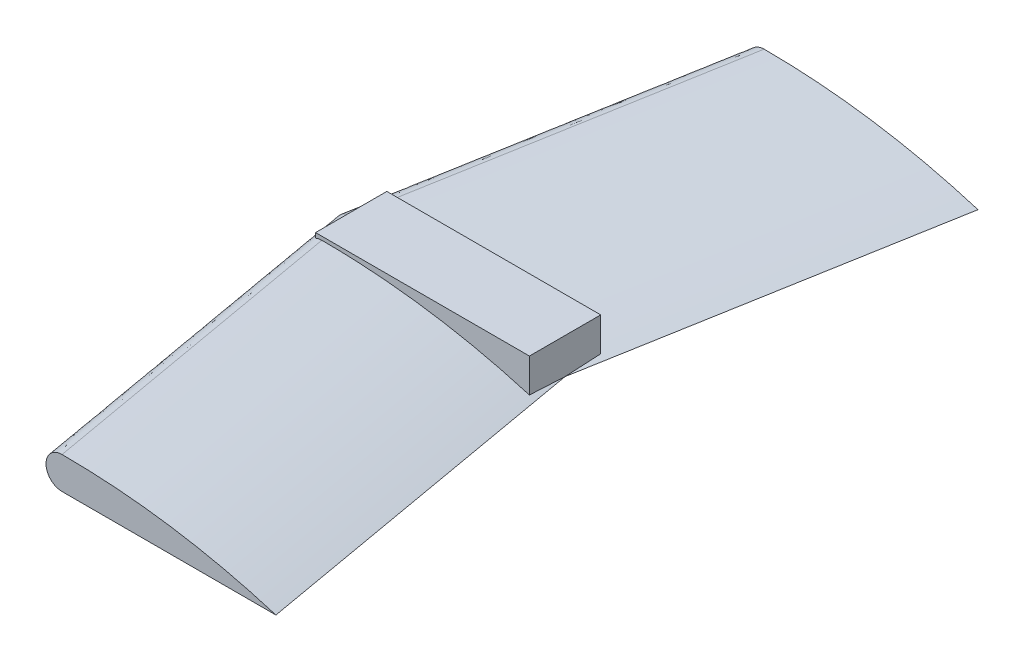
ISO-10303-21;
HEADER;
FILE_DESCRIPTION(('STEP AP214'),'2;1');
FILE_NAME('part.step','',(''),(''),'','','');
FILE_SCHEMA(('AUTOMOTIVE_DESIGN { 1 0 10303 214 1 1 1 1 }'));
ENDSEC;
DATA;
#1=APPLICATION_CONTEXT('core data for automotive mechanical design processes');
#2=APPLICATION_PROTOCOL_DEFINITION('international standard','automotive_design',2000,#1);
#3=PRODUCT_CONTEXT('',#1,'mechanical');
#4=PRODUCT('Part','Part','',(#3));
#5=PRODUCT_RELATED_PRODUCT_CATEGORY('part','',(#4));
#6=PRODUCT_DEFINITION_FORMATION('','',#4);
#7=PRODUCT_DEFINITION_CONTEXT('part definition',#1,'design');
#8=PRODUCT_DEFINITION('design','',#6,#7);
#9=PRODUCT_DEFINITION_SHAPE('','',#8);
#10=(LENGTH_UNIT() NAMED_UNIT(*) SI_UNIT(.MILLI.,.METRE.));
#11=(NAMED_UNIT(*) PLANE_ANGLE_UNIT() SI_UNIT($,.RADIAN.));
#12=(NAMED_UNIT(*) SI_UNIT($,.STERADIAN.) SOLID_ANGLE_UNIT());
#13=UNCERTAINTY_MEASURE_WITH_UNIT(LENGTH_MEASURE(1.E-05),#10,'distance_accuracy_value','');
#14=(GEOMETRIC_REPRESENTATION_CONTEXT(3) GLOBAL_UNCERTAINTY_ASSIGNED_CONTEXT((#13)) GLOBAL_UNIT_ASSIGNED_CONTEXT((#10,
#11,#12)) REPRESENTATION_CONTEXT('',''));
#15=CARTESIAN_POINT('',(0.,0.,0.));
#16=DIRECTION('',(0.,0.,1.));
#17=DIRECTION('',(1.,0.,0.));
#18=AXIS2_PLACEMENT_3D('',#15,#16,#17);
#19=CARTESIAN_POINT('',(17.3648177666927,0.,-98.4807753012208));
#20=DIRECTION('',(0.,0.,1.));
#21=DIRECTION('',(1.,0.,0.));
#22=AXIS2_PLACEMENT_3D('',#19,#20,#21);
#23=PLANE('',#22);
#24=CARTESIAN_POINT('',(17.3648177666927,0.,-98.4807753012208));
#25=DIRECTION('',(0.,0.,1.));
#26=DIRECTION('',(1.,0.,0.));
#27=AXIS2_PLACEMENT_3D('',#24,#25,#26);
#28=CIRCLE('',#27,4.5);
#29=CARTESIAN_POINT('',(17.3648177666927,4.5,-98.4807753012208));
#30=VERTEX_POINT('',#29);
#31=CARTESIAN_POINT('',(17.3648177666927,-4.5,-98.4807753012208));
#32=VERTEX_POINT('',#31);
#33=EDGE_CURVE('E317',#30,#32,#28,.T.);
#34=ORIENTED_EDGE('',*,*,#33,.F.);
#35=CARTESIAN_POINT('',(17.3648177666931,-199.999999999997,-98.4807753012208));
#36=DIRECTION('',(0.,0.,1.));
#37=DIRECTION('',(-1.,0.,0.));
#38=AXIS2_PLACEMENT_3D('',#35,#36,#37);
#39=CIRCLE('',#38,204.499999999997);
#40=CARTESIAN_POINT('',(77.3648177666927,-4.5,-98.4807753012208));
#41=VERTEX_POINT('',#40);
#42=EDGE_CURVE('E325',#41,#30,#39,.T.);
#43=ORIENTED_EDGE('',*,*,#42,.F.);
#44=DIRECTION('',(1.,0.,0.));
#45=VECTOR('',#44,1.);
#46=CARTESIAN_POINT('',(17.3648177666927,-4.5,-98.4807753012208));
#47=LINE('',#46,#45);
#48=EDGE_CURVE('E302',#32,#41,#47,.T.);
#49=ORIENTED_EDGE('',*,*,#48,.F.);
#50=EDGE_LOOP('',(#34,#43,#49));
#51=FACE_BOUND('',#50,.T.);
#52=ADVANCED_FACE('F33',(#51),#23,.F.);
#53=CARTESIAN_POINT('',(17.3648177666927,0.,98.4807753012209));
#54=DIRECTION('',(0.,0.,1.));
#55=DIRECTION('',(1.,0.,0.));
#56=AXIS2_PLACEMENT_3D('',#53,#54,#55);
#57=PLANE('',#56);
#58=CARTESIAN_POINT('',(17.3648177666927,0.,98.4807753012209));
#59=DIRECTION('',(0.,0.,1.));
#60=DIRECTION('',(1.,0.,0.));
#61=AXIS2_PLACEMENT_3D('',#58,#59,#60);
#62=CIRCLE('',#61,4.5);
#63=CARTESIAN_POINT('',(17.3648177666927,4.5,98.4807753012209));
#64=VERTEX_POINT('',#63);
#65=CARTESIAN_POINT('',(17.3648177666927,-4.5,98.4807753012209));
#66=VERTEX_POINT('',#65);
#67=EDGE_CURVE('E301',#64,#66,#62,.T.);
#68=ORIENTED_EDGE('',*,*,#67,.T.);
#69=DIRECTION('',(1.,0.,0.));
#70=VECTOR('',#69,1.);
#71=CARTESIAN_POINT('',(17.3648177666927,-4.5,98.4807753012209));
#72=LINE('',#71,#70);
#73=CARTESIAN_POINT('',(77.3648177666927,-4.5,98.4807753012209));
#74=VERTEX_POINT('',#73);
#75=EDGE_CURVE('E308',#66,#74,#72,.T.);
#76=ORIENTED_EDGE('',*,*,#75,.T.);
#77=CARTESIAN_POINT('',(17.3648177666931,-199.999999999997,98.4807753012209));
#78=DIRECTION('',(0.,0.,1.));
#79=DIRECTION('',(-1.,0.,0.));
#80=AXIS2_PLACEMENT_3D('',#77,#78,#79);
#81=CIRCLE('',#80,204.499999999997);
#82=EDGE_CURVE('E85',#74,#64,#81,.T.);
#83=ORIENTED_EDGE('',*,*,#82,.T.);
#84=EDGE_LOOP('',(#68,#76,#83));
#85=FACE_BOUND('',#84,.T.);
#86=ADVANCED_FACE('F260',(#85),#57,.T.);
#87=CARTESIAN_POINT('',(60.0000000000001,-4.50000000000003,0.));
#88=CARTESIAN_POINT('',(77.3648177666928,-4.50000000000003,-98.4807753012209));
#89=CARTESIAN_POINT('',(40.5226338305222,1.47770828730783,0.));
#90=CARTESIAN_POINT('',(57.8874515972149,1.47770828730783,-98.4807753012209));
#91=CARTESIAN_POINT('',(20.3740224125742,4.50000000000004,0.));
#92=CARTESIAN_POINT('',(37.7388401792669,4.50000000000004,-98.4807753012209));
#93=CARTESIAN_POINT('',(0.,4.5,0.));
#94=CARTESIAN_POINT('',(17.3648177666928,4.5,-98.4807753012209));
#95=(BOUNDED_SURFACE() B_SPLINE_SURFACE(3,1,((#87,#88),(#89,#90),(#91,#92),(#93,#94)),
.UNSPECIFIED.,.F.,.F.,.F.) B_SPLINE_SURFACE_WITH_KNOTS((4,4),(2,2),(0.,1.),(0.,1.),
.UNSPECIFIED.) GEOMETRIC_REPRESENTATION_ITEM() RATIONAL_B_SPLINE_SURFACE(((1.,1.),
(0.992624235245531,0.992624235245531),(0.992624235245531,0.992624235245531),(1.,1.))) REPRESENTATION_ITEM('') SURFACE());
#96=CARTESIAN_POINT('',(1.76326980708471,4.5,-10.));
#97=CARTESIAN_POINT('',(4.31250304328207,4.50002406354996,-10.));
#98=CARTESIAN_POINT('',(6.86173588443566,4.45233400801522,-10.));
#99=CARTESIAN_POINT('',(11.9564287805374,4.26170563802279,-10.));
#100=CARTESIAN_POINT('',(14.5018891275969,4.11877513094824,-10.));
#101=CARTESIAN_POINT('',(19.5856896246853,3.73784537042599,-10.));
#102=CARTESIAN_POINT('',(22.1240297592419,3.4998459105551,-10.));
#103=CARTESIAN_POINT('',(27.1902440266664,2.92909424924241,-10.));
#104=CARTESIAN_POINT('',(29.7181173317687,2.59633469364222,-10.));
#105=CARTESIAN_POINT('',(34.5836730969965,1.86305822995368,-10.));
#106=CARTESIAN_POINT('',(36.9223150867237,1.46889192678415,-10.));
#107=CARTESIAN_POINT('',(41.5846552623633,0.599429390432269,-10.));
#108=CARTESIAN_POINT('',(43.9083523367531,0.124127193576959,-10.));
#109=CARTESIAN_POINT('',(48.5391335342103,-0.907312269553418,-10.));
#110=CARTESIAN_POINT('',(50.8462073612458,-1.46349575605062,-10.));
#111=CARTESIAN_POINT('',(55.4394421310271,-2.65575788614627,-10.));
#112=CARTESIAN_POINT('',(57.7256045496751,-3.29183084382734,-10.));
#113=CARTESIAN_POINT('',(60.,-3.96751989418289,-10.));
#114=B_SPLINE_CURVE_WITH_KNOTS('',3,(#96,#97,#98,#99,#100,#101,#102,#103,#104,#105,#106,#107,
#108,#109,#110,#111,#112,#113),.UNSPECIFIED.,.F.,.F.,(4,2,2,2,2,2,2,2,4),(0.,7.64725376197817,
15.2938807136551,22.9405242685423,30.5877614273107,37.7012265312168,44.815214716319,
51.9332843364212,59.0508476339131),.UNSPECIFIED.);
#115=CARTESIAN_POINT('',(1.76326980708462,4.5,-10.));
#116=VERTEX_POINT('',#115);
#117=CARTESIAN_POINT('',(60.,-3.96751989418289,-10.));
#118=VERTEX_POINT('',#117);
#119=EDGE_CURVE('E273',#116,#118,#114,.T.);
#120=CARTESIAN_POINT('',(60.,-3.96751989418289,-10.));
#121=CARTESIAN_POINT('',(60.,-4.05482649096182,-8.33325665153762));
#122=CARTESIAN_POINT('',(60.,-4.14285313150271,-6.6665516439731));
#123=CARTESIAN_POINT('',(60.,-4.32034650010842,-3.33321831063976));
#124=CARTESIAN_POINT('',(60.,-4.40981322817324,-1.66658998487095));
#125=CARTESIAN_POINT('',(60.0000000000001,-4.50000000000003,0.));
#126=B_SPLINE_CURVE_WITH_KNOTS('',3,(#120,#121,#122,#123,#124,#125),.UNSPECIFIED.,.F.,.F.,(4,2,
4),(0.,5.00708382645729,10.0141676529146),.UNSPECIFIED.);
#127=CARTESIAN_POINT('',(60.,-4.5,0.));
#128=VERTEX_POINT('',#127);
#129=EDGE_CURVE('E238',#118,#128,#126,.T.);
#130=DIRECTION('',(0.173648177666927,0.,-0.984807753012209));
#131=VECTOR('',#130,1.);
#132=CARTESIAN_POINT('',(60.,-4.5,0.));
#133=LINE('',#132,#131);
#134=EDGE_CURVE('E322',#128,#41,#133,.T.);
#135=DIRECTION('',(0.173648177666927,0.,-0.984807753012209));
#136=VECTOR('',#135,1.);
#137=CARTESIAN_POINT('',(0.,4.5,0.));
#138=LINE('',#137,#136);
#139=EDGE_CURVE('E321',#116,#30,#138,.T.);
#140=ORIENTED_EDGE('',*,*,#119,.T.);
#141=ORIENTED_EDGE('',*,*,#129,.T.);
#142=ORIENTED_EDGE('',*,*,#134,.T.);
#143=ORIENTED_EDGE('',*,*,#42,.T.);
#144=ORIENTED_EDGE('',*,*,#139,.F.);
#145=EDGE_LOOP('',(#140,#141,#142,#143,#144));
#146=FACE_BOUND('',#145,.T.);
#147=ADVANCED_FACE('F255',(#146),#95,.F.);
#148=CARTESIAN_POINT('',(0.,4.5,0.));
#149=CARTESIAN_POINT('',(17.3648177666927,4.5,-98.4807753012209));
#150=CARTESIAN_POINT('',(-9.,4.5,0.));
#151=CARTESIAN_POINT('',(8.36481776669272,4.5,-98.4807753012209));
#152=CARTESIAN_POINT('',(-9.,-4.5,0.));
#153=CARTESIAN_POINT('',(8.36481776669273,-4.5,-98.4807753012209));
#154=CARTESIAN_POINT('',(0.,-4.5,0.));
#155=CARTESIAN_POINT('',(17.3648177666927,-4.5,-98.4807753012209));
#156=(BOUNDED_SURFACE() B_SPLINE_SURFACE(3,1,((#148,#149),(#150,#151),(#152,#153),(#154,#155)),
.UNSPECIFIED.,.F.,.F.,.F.) B_SPLINE_SURFACE_WITH_KNOTS((4,4),(2,2),(0.,1.),(0.,1.),
.UNSPECIFIED.) GEOMETRIC_REPRESENTATION_ITEM() RATIONAL_B_SPLINE_SURFACE(((1.,1.),
(0.333333333333334,0.333333333333334),(0.333333333333334,0.333333333333334),(1.,1.))) REPRESENTATION_ITEM('') SURFACE());
#157=CARTESIAN_POINT('',(0.,4.5,0.));
#158=CARTESIAN_POINT('',(0.,4.4999560199721,-0.72806018290363));
#159=CARTESIAN_POINT('',(0.,4.49450420711944,-1.4561257697866));
#160=CARTESIAN_POINT('',(0.,4.47247550616679,-2.91214142268654));
#161=CARTESIAN_POINT('',(0.,4.45589779936072,-3.64009147625868));
#162=CARTESIAN_POINT('',(0.,4.41132234884053,-5.09516813912142));
#163=CARTESIAN_POINT('',(0.,4.38333205600468,-5.82229497586553));
#164=CARTESIAN_POINT('',(0.,4.31528032364363,-7.27596308952765));
#165=CARTESIAN_POINT('',(0.,4.27521941075436,-8.00250439060597));
#166=CARTESIAN_POINT('',(0.,4.21501266792418,-8.94058180597457));
#167=CARTESIAN_POINT('',(0.,4.2008510850687,-9.15251026946948));
#168=CARTESIAN_POINT('',(0.,4.17137573738578,-9.5763070041018));
#169=CARTESIAN_POINT('',(0.,4.1560618645849,-9.7881752677265));
#170=CARTESIAN_POINT('',(0.,4.14015453665969,-10.));
#171=B_SPLINE_CURVE_WITH_KNOTS('',3,(#157,#158,#159,#160,#161,#162,#163,#164,#165,#166,#167,
#168,#169,#170),.UNSPECIFIED.,.F.,.F.,(4,2,2,2,2,2,4),(0.,2.18416920676869,4.36849915466009,
6.55140530755492,8.73421623498342,9.37141722964306,10.0086780067112),.UNSPECIFIED.);
#172=CARTESIAN_POINT('',(0.,4.5,0.));
#173=VERTEX_POINT('',#172);
#174=CARTESIAN_POINT('',(0.,4.14015453665969,-10.));
#175=VERTEX_POINT('',#174);
#176=EDGE_CURVE('E338',#173,#175,#171,.T.);
#177=CARTESIAN_POINT('',(0.,4.14015453665969,-10.));
#178=CARTESIAN_POINT('',(0.117351035793753,4.19014955914874,-10.));
#179=CARTESIAN_POINT('',(0.236837793790035,4.23512835351973,-10.));
#180=CARTESIAN_POINT('',(0.47923692282307,4.31480071270383,-10.));
#181=CARTESIAN_POINT('',(0.602150419854154,4.34949085212586,-10.));
#182=CARTESIAN_POINT('',(0.848414501444724,4.40781085334799,-10.));
#183=CARTESIAN_POINT('',(0.971723874931012,4.43161494368378,-10.));
#184=CARTESIAN_POINT('',(1.21984895903272,4.46882682676338,-10.));
#185=CARTESIAN_POINT('',(1.344663958753,4.48223934478962,-10.));
#186=CARTESIAN_POINT('',(1.56749932032844,4.49680773678931,-10.));
#187=CARTESIAN_POINT('',(1.66538958276881,4.50000724880244,-10.));
#188=CARTESIAN_POINT('',(1.76326980708462,4.5,-10.));
#189=B_SPLINE_CURVE_WITH_KNOTS('',3,(#177,#178,#179,#180,#181,#182,#183,#184,#185,#186,#187,
#188),.UNSPECIFIED.,.F.,.F.,(4,2,2,2,2,4),(0.,0.382554925948144,0.76523707290292,
1.14155946806428,1.51771064034255,1.81132479096432),.UNSPECIFIED.);
#190=EDGE_CURVE('E253',#175,#116,#189,.T.);
#191=DIRECTION('',(0.173648177666927,0.,-0.984807753012209));
#192=VECTOR('',#191,1.);
#193=CARTESIAN_POINT('',(0.,-4.5,0.));
#194=LINE('',#193,#192);
#195=CARTESIAN_POINT('',(1.76326980708462,-4.5,-10.));
#196=VERTEX_POINT('',#195);
#197=EDGE_CURVE('E77',#196,#32,#194,.T.);
#198=CARTESIAN_POINT('',(1.76326980708462,-4.5,-10.));
#199=CARTESIAN_POINT('',(1.63571288777741,-4.50001457353793,-10.));
#200=CARTESIAN_POINT('',(1.50815657816348,-4.49457718839302,-10.));
#201=CARTESIAN_POINT('',(1.25392241835073,-4.47289736924575,-10.));
#202=CARTESIAN_POINT('',(1.12724487439594,-4.45665134255892,-10.));
#203=CARTESIAN_POINT('',(0.877821485080936,-4.41381218655888,-10.));
#204=CARTESIAN_POINT('',(0.755045286008538,-4.38739550153536,-10.));
#205=CARTESIAN_POINT('',(0.512180667674857,-4.32440694095123,-10.));
#206=CARTESIAN_POINT('',(0.392091050917562,-4.28783969136826,-10.));
#207=CARTESIAN_POINT('',(0.181366420049626,-4.21392780897118,-10.));
#208=CARTESIAN_POINT('',(0.0900503273679514,-4.17851437119512,-10.));
#209=CARTESIAN_POINT('',(0.,-4.14015453665969,-10.));
#210=B_SPLINE_CURVE_WITH_KNOTS('',3,(#198,#199,#200,#201,#202,#203,#204,#205,#206,#207,#208,
#209),.UNSPECIFIED.,.F.,.F.,(4,2,2,2,2,4),(0.,0.38255492594819,0.765237072902929,
1.14155946806429,1.51771064034259,1.81132479096436),.UNSPECIFIED.);
#211=CARTESIAN_POINT('',(0.,-4.14015453665969,-10.));
#212=VERTEX_POINT('',#211);
#213=EDGE_CURVE('E280',#196,#212,#210,.T.);
#214=CARTESIAN_POINT('',(0.,-4.14015453665969,-10.));
#215=CARTESIAN_POINT('',(0.,-4.16741444516371,-9.63693798723258));
#216=CARTESIAN_POINT('',(0.,-4.1929400375232,-9.27374904409508));
#217=CARTESIAN_POINT('',(0.,-4.2406778441172,-8.5471560375621));
#218=CARTESIAN_POINT('',(0.,-4.26289008388143,-8.1837519758458));
#219=CARTESIAN_POINT('',(0.,-4.32478963967222,-7.09327740604659));
#220=CARTESIAN_POINT('',(0.,-4.35974057653092,-6.36593394451145));
#221=CARTESIAN_POINT('',(0.,-4.41784544875091,-4.91119795254887));
#222=CARTESIAN_POINT('',(0.,-4.44100605503619,-4.18380568327574));
#223=CARTESIAN_POINT('',(0.,-4.47607599679357,-2.7287579726922));
#224=CARTESIAN_POINT('',(0.,-4.4879855136196,-2.00110253581287));
#225=CARTESIAN_POINT('',(0.,-4.49626381227068,-1.06118672745433));
#226=CARTESIAN_POINT('',(0.,-4.49766513683226,-0.848962597462669));
#227=CARTESIAN_POINT('',(0.,-4.49953330303378,-0.424492560230889));
#228=CARTESIAN_POINT('',(0.,-4.50000006688821,-0.212246652648356));
#229=CARTESIAN_POINT('',(0.,-4.5,0.));
#230=B_SPLINE_CURVE_WITH_KNOTS('',3,(#214,#215,#216,#217,#218,#219,#220,#221,#222,#223,#224,
#225,#226,#227,#228,#229),.UNSPECIFIED.,.F.,.F.,(4,2,2,2,2,2,2,4),(0.,1.09224201880062,
2.18447562133392,4.36891103732877,6.55210913059169,8.73527203274488,9.37195699366786,
10.0086949450701),.UNSPECIFIED.);
#231=CARTESIAN_POINT('',(0.,-4.5,0.));
#232=VERTEX_POINT('',#231);
#233=EDGE_CURVE('E239',#212,#232,#230,.T.);
#234=CARTESIAN_POINT('',(0.,0.,0.));
#235=DIRECTION('',(0.,0.,1.));
#236=DIRECTION('',(1.,0.,0.));
#237=AXIS2_PLACEMENT_3D('',#234,#235,#236);
#238=CIRCLE('',#237,4.5);
#239=EDGE_CURVE('E41',#173,#232,#238,.T.);
#240=ORIENTED_EDGE('',*,*,#176,.T.);
#241=ORIENTED_EDGE('',*,*,#190,.T.);
#242=ORIENTED_EDGE('',*,*,#139,.T.);
#243=ORIENTED_EDGE('',*,*,#33,.T.);
#244=ORIENTED_EDGE('',*,*,#197,.F.);
#245=ORIENTED_EDGE('',*,*,#213,.T.);
#246=ORIENTED_EDGE('',*,*,#233,.T.);
#247=ORIENTED_EDGE('',*,*,#239,.F.);
#248=EDGE_LOOP('',(#240,#241,#242,#243,#244,#245,#246,#247));
#249=FACE_BOUND('',#248,.T.);
#250=ADVANCED_FACE('F223',(#249),#156,.F.);
#251=CARTESIAN_POINT('',(77.3648177666928,-4.50000000000003,98.4807753012209));
#252=CARTESIAN_POINT('',(60.0000000000001,-4.50000000000003,0.));
#253=CARTESIAN_POINT('',(57.8874515972149,1.47770828730783,98.4807753012209));
#254=CARTESIAN_POINT('',(40.5226338305222,1.47770828730783,0.));
#255=CARTESIAN_POINT('',(37.7388401792669,4.50000000000004,98.4807753012209));
#256=CARTESIAN_POINT('',(20.3740224125742,4.50000000000004,0.));
#257=CARTESIAN_POINT('',(17.3648177666928,4.5,98.4807753012209));
#258=CARTESIAN_POINT('',(0.,4.5,0.));
#259=(BOUNDED_SURFACE() B_SPLINE_SURFACE(3,1,((#251,#252),(#253,#254),(#255,#256),(#257,#258)),
.UNSPECIFIED.,.F.,.F.,.F.) B_SPLINE_SURFACE_WITH_KNOTS((4,4),(2,2),(0.,1.),(0.,1.),
.UNSPECIFIED.) GEOMETRIC_REPRESENTATION_ITEM() RATIONAL_B_SPLINE_SURFACE(((1.,1.),
(0.992624235245531,0.992624235245531),(0.992624235245531,0.992624235245531),(1.,1.))) REPRESENTATION_ITEM('') SURFACE());
#260=DIRECTION('',(-0.173648177666927,0.,-0.984807753012209));
#261=VECTOR('',#260,1.);
#262=CARTESIAN_POINT('',(77.3648177666927,-4.5,98.4807753012209));
#263=LINE('',#262,#261);
#264=EDGE_CURVE('E306',#74,#128,#263,.T.);
#265=CARTESIAN_POINT('',(60.,-4.50000000000003,-5.48172618408671E-13));
#266=CARTESIAN_POINT('',(60.,-4.40981322817326,1.6665899848705));
#267=CARTESIAN_POINT('',(60.,-4.32034650010844,3.3332183106394));
#268=CARTESIAN_POINT('',(60.,-4.14285313150273,6.66655164397292));
#269=CARTESIAN_POINT('',(60.,-4.05482649096183,8.33325665153753));
#270=CARTESIAN_POINT('',(60.,-3.9675198941829,10.));
#271=B_SPLINE_CURVE_WITH_KNOTS('',3,(#265,#266,#267,#268,#269,#270),.UNSPECIFIED.,.F.,.F.,(4,2,
4),(0.,5.00708382645756,10.0141676529151),.UNSPECIFIED.);
#272=CARTESIAN_POINT('',(60.,-3.9675198941829,10.));
#273=VERTEX_POINT('',#272);
#274=EDGE_CURVE('E231',#128,#273,#271,.T.);
#275=CARTESIAN_POINT('',(60.,-3.9675198941829,10.));
#276=CARTESIAN_POINT('',(57.5563270793277,-3.24153590683512,10.));
#277=CARTESIAN_POINT('',(55.0990666924544,-2.56129050191424,10.));
#278=CARTESIAN_POINT('',(50.1610380530868,-1.29317850456512,10.));
#279=CARTESIAN_POINT('',(47.6802717439331,-0.705304344839627,10.));
#280=CARTESIAN_POINT('',(42.6984911889531,0.377283978887767,10.));
#281=CARTESIAN_POINT('',(40.197476899174,0.871997940607508,10.));
#282=CARTESIAN_POINT('',(35.1784976419724,1.76761598314961,10.));
#283=CARTESIAN_POINT('',(32.6605313737519,2.16851277859167,10.));
#284=CARTESIAN_POINT('',(27.7876189663025,2.85119275198075,10.));
#285=CARTESIAN_POINT('',(25.4335615287736,3.13933683310108,10.));
#286=CARTESIAN_POINT('',(20.7166678228079,3.63359868892577,10.));
#287=CARTESIAN_POINT('',(18.3538309215579,3.83971043035366,10.));
#288=CARTESIAN_POINT('',(13.621062292269,4.16971492493692,10.));
#289=CARTESIAN_POINT('',(11.2511272715263,4.29356043959838,10.));
#290=CARTESIAN_POINT('',(6.50855195799038,4.45870895647658,10.));
#291=CARTESIAN_POINT('',(4.13591186961987,4.50001782948163,10.));
#292=CARTESIAN_POINT('',(1.76326980708471,4.5,10.));
#293=B_SPLINE_CURVE_WITH_KNOTS('',3,(#275,#276,#277,#278,#279,#280,#281,#282,#283,#284,#285,
#286,#287,#288,#289,#290,#291,#292),.UNSPECIFIED.,.F.,.F.,(4,2,2,2,2,2,2,2,4),(0.,
7.64725376197818,15.2938807136551,22.9405242685423,30.5877614273108,37.7012265312168,
44.815214716319,51.9332843364212,59.0508476339131),.UNSPECIFIED.);
#294=CARTESIAN_POINT('',(1.76326980708462,4.5,10.));
#295=VERTEX_POINT('',#294);
#296=EDGE_CURVE('E140',#273,#295,#293,.T.);
#297=DIRECTION('',(-0.173648177666927,0.,-0.984807753012209));
#298=VECTOR('',#297,1.);
#299=CARTESIAN_POINT('',(17.3648177666927,4.5,98.4807753012209));
#300=LINE('',#299,#298);
#301=EDGE_CURVE('E303',#64,#295,#300,.T.);
#302=ORIENTED_EDGE('',*,*,#264,.T.);
#303=ORIENTED_EDGE('',*,*,#274,.T.);
#304=ORIENTED_EDGE('',*,*,#296,.T.);
#305=ORIENTED_EDGE('',*,*,#301,.F.);
#306=ORIENTED_EDGE('',*,*,#82,.F.);
#307=EDGE_LOOP('',(#302,#303,#304,#305,#306));
#308=FACE_BOUND('',#307,.T.);
#309=ADVANCED_FACE('F218',(#308),#259,.F.);
#310=CARTESIAN_POINT('',(17.3648177666927,4.5,98.4807753012209));
#311=CARTESIAN_POINT('',(0.,4.5,0.));
#312=CARTESIAN_POINT('',(8.36481776669273,4.5,98.4807753012209));
#313=CARTESIAN_POINT('',(-9.,4.5,0.));
#314=CARTESIAN_POINT('',(8.36481776669273,-4.5,98.4807753012209));
#315=CARTESIAN_POINT('',(-9.,-4.5,0.));
#316=CARTESIAN_POINT('',(17.3648177666927,-4.5,98.4807753012209));
#317=CARTESIAN_POINT('',(0.,-4.5,0.));
#318=(BOUNDED_SURFACE() B_SPLINE_SURFACE(3,1,((#310,#311),(#312,#313),(#314,#315),(#316,#317)),
.UNSPECIFIED.,.F.,.F.,.F.) B_SPLINE_SURFACE_WITH_KNOTS((4,4),(2,2),(0.,1.),(0.,1.),
.UNSPECIFIED.) GEOMETRIC_REPRESENTATION_ITEM() RATIONAL_B_SPLINE_SURFACE(((1.,1.),
(0.333333333333334,0.333333333333334),(0.333333333333334,0.333333333333334),(1.,1.))) REPRESENTATION_ITEM('') SURFACE());
#319=CARTESIAN_POINT('',(1.76326980708462,4.5,10.));
#320=CARTESIAN_POINT('',(1.63571288777741,4.50001457353793,10.));
#321=CARTESIAN_POINT('',(1.50815657816348,4.49457718839302,10.));
#322=CARTESIAN_POINT('',(1.25392241835073,4.47289736924575,10.));
#323=CARTESIAN_POINT('',(1.12724487439594,4.45665134255892,10.));
#324=CARTESIAN_POINT('',(0.877821485080936,4.41381218655888,10.));
#325=CARTESIAN_POINT('',(0.755045286008537,4.38739550153536,10.));
#326=CARTESIAN_POINT('',(0.512180667674857,4.32440694095123,10.));
#327=CARTESIAN_POINT('',(0.392091050917562,4.28783969136826,9.99999999999999));
#328=CARTESIAN_POINT('',(0.181366420049626,4.21392780897118,9.99999999999999));
#329=CARTESIAN_POINT('',(0.0900503273679517,4.17851437119512,9.99999999999999));
#330=CARTESIAN_POINT('',(0.,4.14015453665969,10.));
#331=B_SPLINE_CURVE_WITH_KNOTS('',3,(#319,#320,#321,#322,#323,#324,#325,#326,#327,#328,#329,
#330),.UNSPECIFIED.,.F.,.F.,(4,2,2,2,2,4),(0.,0.38255492594819,0.765237072902929,
1.14155946806429,1.51771064034259,1.81132479096436),.UNSPECIFIED.);
#332=CARTESIAN_POINT('',(0.,4.14015453665969,10.));
#333=VERTEX_POINT('',#332);
#334=EDGE_CURVE('E179',#295,#333,#331,.T.);
#335=CARTESIAN_POINT('',(0.,4.14015453665969,10.));
#336=CARTESIAN_POINT('',(0.,4.16741444516371,9.63693798723257));
#337=CARTESIAN_POINT('',(0.,4.1929400375232,9.27374904409508));
#338=CARTESIAN_POINT('',(0.,4.2406778441172,8.5471560375621));
#339=CARTESIAN_POINT('',(0.,4.26289008388143,8.1837519758458));
#340=CARTESIAN_POINT('',(0.,4.32478963967222,7.09327740604659));
#341=CARTESIAN_POINT('',(0.,4.35974057653092,6.36593394451145));
#342=CARTESIAN_POINT('',(0.,4.41784544875091,4.91119795254887));
#343=CARTESIAN_POINT('',(0.,4.4410060550362,4.18380568327574));
#344=CARTESIAN_POINT('',(0.,4.47607599679357,2.7287579726922));
#345=CARTESIAN_POINT('',(0.,4.4879855136196,2.00110253581287));
#346=CARTESIAN_POINT('',(0.,4.49626381227068,1.06118672745433));
#347=CARTESIAN_POINT('',(0.,4.49766513683226,0.848962597462669));
#348=CARTESIAN_POINT('',(0.,4.49953330303379,0.424492560230889));
#349=CARTESIAN_POINT('',(0.,4.50000006688821,0.212246652648356));
#350=CARTESIAN_POINT('',(0.,4.5,0.));
#351=B_SPLINE_CURVE_WITH_KNOTS('',3,(#335,#336,#337,#338,#339,#340,#341,#342,#343,#344,#345,
#346,#347,#348,#349,#350),.UNSPECIFIED.,.F.,.F.,(4,2,2,2,2,2,2,4),(0.,1.09224201880062,
2.18447562133393,4.36891103732877,6.55210913059169,8.73527203274487,9.37195699366785,
10.0086949450701),.UNSPECIFIED.);
#352=EDGE_CURVE('E216',#333,#173,#351,.T.);
#353=CARTESIAN_POINT('',(0.,-4.5,0.));
#354=CARTESIAN_POINT('',(0.,-4.4999560199721,0.728060182903632));
#355=CARTESIAN_POINT('',(0.,-4.49450420711944,1.4561257697866));
#356=CARTESIAN_POINT('',(0.,-4.47247550616679,2.91214142268654));
#357=CARTESIAN_POINT('',(0.,-4.45589779936072,3.64009147625868));
#358=CARTESIAN_POINT('',(0.,-4.41132234884053,5.09516813912141));
#359=CARTESIAN_POINT('',(0.,-4.38333205600468,5.82229497586552));
#360=CARTESIAN_POINT('',(0.,-4.31528032364363,7.27596308952764));
#361=CARTESIAN_POINT('',(0.,-4.27521941075437,8.00250439060596));
#362=CARTESIAN_POINT('',(0.,-4.21501266792418,8.94058180597456));
#363=CARTESIAN_POINT('',(0.,-4.2008510850687,9.15251026946947));
#364=CARTESIAN_POINT('',(0.,-4.17137573738578,9.57630700410179));
#365=CARTESIAN_POINT('',(0.,-4.15606186458489,9.78817526772649));
#366=CARTESIAN_POINT('',(0.,-4.14015453665969,9.99999999999999));
#367=B_SPLINE_CURVE_WITH_KNOTS('',3,(#353,#354,#355,#356,#357,#358,#359,#360,#361,#362,#363,
#364,#365,#366),.UNSPECIFIED.,.F.,.F.,(4,2,2,2,2,2,4),(0.,2.18416920676869,4.36849915466008,
6.55140530755491,8.73421623498341,9.37141722964305,10.0086780067112),.UNSPECIFIED.);
#368=CARTESIAN_POINT('',(0.,-4.14015453665969,10.));
#369=VERTEX_POINT('',#368);
#370=EDGE_CURVE('E355',#232,#369,#367,.T.);
#371=CARTESIAN_POINT('',(0.,-4.14015453665969,9.99999999999999));
#372=CARTESIAN_POINT('',(0.117351035793753,-4.19014955914874,10.));
#373=CARTESIAN_POINT('',(0.236837793790034,-4.23512835351973,10.));
#374=CARTESIAN_POINT('',(0.479236922823069,-4.31480071270383,10.));
#375=CARTESIAN_POINT('',(0.602150419854153,-4.34949085212586,10.));
#376=CARTESIAN_POINT('',(0.848414501444723,-4.40781085334798,10.));
#377=CARTESIAN_POINT('',(0.97172387493101,-4.43161494368377,10.));
#378=CARTESIAN_POINT('',(1.21984895903272,-4.46882682676338,10.));
#379=CARTESIAN_POINT('',(1.344663958753,-4.48223934478962,10.));
#380=CARTESIAN_POINT('',(1.56749932032844,-4.49680773678931,10.));
#381=CARTESIAN_POINT('',(1.66538958276882,-4.50000724880244,10.));
#382=CARTESIAN_POINT('',(1.76326980708462,-4.5,10.));
#383=B_SPLINE_CURVE_WITH_KNOTS('',3,(#371,#372,#373,#374,#375,#376,#377,#378,#379,#380,#381,
#382),.UNSPECIFIED.,.F.,.F.,(4,2,2,2,2,4),(0.,0.382554925948143,0.765237072902919,
1.14155946806428,1.51771064034255,1.81132479096433),.UNSPECIFIED.);
#384=CARTESIAN_POINT('',(1.76326980708462,-4.5,10.));
#385=VERTEX_POINT('',#384);
#386=EDGE_CURVE('E176',#369,#385,#383,.T.);
#387=DIRECTION('',(-0.173648177666927,0.,-0.984807753012209));
#388=VECTOR('',#387,1.);
#389=CARTESIAN_POINT('',(17.3648177666927,-4.5,98.4807753012209));
#390=LINE('',#389,#388);
#391=EDGE_CURVE('E11',#66,#385,#390,.T.);
#392=ORIENTED_EDGE('',*,*,#334,.T.);
#393=ORIENTED_EDGE('',*,*,#352,.T.);
#394=ORIENTED_EDGE('',*,*,#239,.T.);
#395=ORIENTED_EDGE('',*,*,#370,.T.);
#396=ORIENTED_EDGE('',*,*,#386,.T.);
#397=ORIENTED_EDGE('',*,*,#391,.F.);
#398=ORIENTED_EDGE('',*,*,#67,.F.);
#399=ORIENTED_EDGE('',*,*,#301,.T.);
#400=EDGE_LOOP('',(#392,#393,#394,#395,#396,#397,#398,#399));
#401=FACE_BOUND('',#400,.T.);
#402=ADVANCED_FACE('F193',(#401),#318,.F.);
#403=CARTESIAN_POINT('',(17.3648177666927,-4.5,98.4807753012209));
#404=DIRECTION('',(0.,1.,0.));
#405=DIRECTION('',(-1.,0.,0.));
#406=AXIS2_PLACEMENT_3D('',#403,#404,#405);
#407=PLANE('',#406);
#408=DIRECTION('',(0.,0.,-1.));
#409=VECTOR('',#408,1.);
#410=CARTESIAN_POINT('',(0.,-4.5,-10.));
#411=LINE('',#410,#409);
#412=CARTESIAN_POINT('',(0.,-4.5,10.));
#413=VERTEX_POINT('',#412);
#414=EDGE_CURVE('E162',#413,#232,#411,.T.);
#415=ORIENTED_EDGE('',*,*,#414,.T.);
#416=CARTESIAN_POINT('',(0.,-4.5,-10.));
#417=VERTEX_POINT('',#416);
#418=EDGE_CURVE('E58',#232,#417,#411,.T.);
#419=ORIENTED_EDGE('',*,*,#418,.T.);
#420=DIRECTION('',(1.,0.,0.));
#421=VECTOR('',#420,1.);
#422=CARTESIAN_POINT('',(0.,-4.5,-10.));
#423=LINE('',#422,#421);
#424=EDGE_CURVE('E160',#417,#196,#423,.T.);
#425=ORIENTED_EDGE('',*,*,#424,.T.);
#426=ORIENTED_EDGE('',*,*,#197,.T.);
#427=ORIENTED_EDGE('',*,*,#48,.T.);
#428=ORIENTED_EDGE('',*,*,#134,.F.);
#429=ORIENTED_EDGE('',*,*,#264,.F.);
#430=ORIENTED_EDGE('',*,*,#75,.F.);
#431=ORIENTED_EDGE('',*,*,#391,.T.);
#432=DIRECTION('',(-1.,0.,0.));
#433=VECTOR('',#432,1.);
#434=CARTESIAN_POINT('',(0.,-4.5,10.));
#435=LINE('',#434,#433);
#436=EDGE_CURVE('E172',#385,#413,#435,.T.);
#437=ORIENTED_EDGE('',*,*,#436,.T.);
#438=EDGE_LOOP('',(#415,#419,#425,#426,#427,#428,#429,#430,#431,#437));
#439=FACE_BOUND('',#438,.T.);
#440=ADVANCED_FACE('F262',(#439),#407,.F.);
#441=CARTESIAN_POINT('',(0.,5.5,10.));
#442=DIRECTION('',(0.,0.,1.));
#443=DIRECTION('',(0.,-1.,0.));
#444=AXIS2_PLACEMENT_3D('',#441,#442,#443);
#445=PLANE('',#444);
#446=ORIENTED_EDGE('',*,*,#386,.F.);
#447=DIRECTION('',(0.,-1.,0.));
#448=VECTOR('',#447,1.);
#449=CARTESIAN_POINT('',(0.,5.5,10.));
#450=LINE('',#449,#448);
#451=EDGE_CURVE('E144',#369,#413,#450,.T.);
#452=ORIENTED_EDGE('',*,*,#451,.T.);
#453=ORIENTED_EDGE('',*,*,#436,.F.);
#454=EDGE_LOOP('',(#446,#452,#453));
#455=FACE_BOUND('',#454,.T.);
#456=ADVANCED_FACE('F204',(#455),#445,.T.);
#457=CARTESIAN_POINT('',(0.,5.5,-10.));
#458=DIRECTION('',(-1.,0.,0.));
#459=DIRECTION('',(0.,-1.,0.));
#460=AXIS2_PLACEMENT_3D('',#457,#458,#459);
#461=PLANE('',#460);
#462=ORIENTED_EDGE('',*,*,#370,.F.);
#463=ORIENTED_EDGE('',*,*,#414,.F.);
#464=ORIENTED_EDGE('',*,*,#451,.F.);
#465=EDGE_LOOP('',(#462,#463,#464));
#466=FACE_BOUND('',#465,.T.);
#467=ADVANCED_FACE('F354',(#466),#461,.T.);
#468=CARTESIAN_POINT('',(0.,5.5,0.));
#469=DIRECTION('',(0.,1.,0.));
#470=DIRECTION('',(-1.,0.,0.));
#471=AXIS2_PLACEMENT_3D('',#468,#469,#470);
#472=PLANE('',#471);
#473=DIRECTION('',(0.,0.,1.));
#474=VECTOR('',#473,1.);
#475=CARTESIAN_POINT('',(60.,5.5,-10.));
#476=LINE('',#475,#474);
#477=CARTESIAN_POINT('',(60.,5.5,-10.));
#478=VERTEX_POINT('',#477);
#479=CARTESIAN_POINT('',(60.,5.5,10.));
#480=VERTEX_POINT('',#479);
#481=EDGE_CURVE('E152',#478,#480,#476,.T.);
#482=ORIENTED_EDGE('',*,*,#481,.F.);
#483=DIRECTION('',(1.,0.,0.));
#484=VECTOR('',#483,1.);
#485=CARTESIAN_POINT('',(0.,5.5,-10.));
#486=LINE('',#485,#484);
#487=CARTESIAN_POINT('',(0.,5.5,-10.));
#488=VERTEX_POINT('',#487);
#489=EDGE_CURVE('E145',#488,#478,#486,.T.);
#490=ORIENTED_EDGE('',*,*,#489,.F.);
#491=DIRECTION('',(0.,0.,-1.));
#492=VECTOR('',#491,1.);
#493=CARTESIAN_POINT('',(0.,5.5,-10.));
#494=LINE('',#493,#492);
#495=CARTESIAN_POINT('',(0.,5.5,10.));
#496=VERTEX_POINT('',#495);
#497=EDGE_CURVE('E155',#496,#488,#494,.T.);
#498=ORIENTED_EDGE('',*,*,#497,.F.);
#499=DIRECTION('',(-1.,0.,0.));
#500=VECTOR('',#499,1.);
#501=CARTESIAN_POINT('',(0.,5.5,10.));
#502=LINE('',#501,#500);
#503=EDGE_CURVE('E138',#480,#496,#502,.T.);
#504=ORIENTED_EDGE('',*,*,#503,.F.);
#505=EDGE_LOOP('',(#482,#490,#498,#504));
#506=FACE_BOUND('',#505,.T.);
#507=ADVANCED_FACE('F150',(#506),#472,.T.);
#508=ORIENTED_EDGE('',*,*,#296,.F.);
#509=DIRECTION('',(0.,-1.,0.));
#510=VECTOR('',#509,1.);
#511=CARTESIAN_POINT('',(60.,5.5,10.));
#512=LINE('',#511,#510);
#513=EDGE_CURVE('E135',#480,#273,#512,.T.);
#514=ORIENTED_EDGE('',*,*,#513,.F.);
#515=ORIENTED_EDGE('',*,*,#503,.T.);
#516=EDGE_CURVE('E49',#496,#333,#450,.T.);
#517=ORIENTED_EDGE('',*,*,#516,.T.);
#518=ORIENTED_EDGE('',*,*,#334,.F.);
#519=EDGE_LOOP('',(#508,#514,#515,#517,#518));
#520=FACE_BOUND('',#519,.T.);
#521=ADVANCED_FACE('F137',(#520),#445,.T.);
#522=ORIENTED_EDGE('',*,*,#176,.F.);
#523=ORIENTED_EDGE('',*,*,#352,.F.);
#524=ORIENTED_EDGE('',*,*,#516,.F.);
#525=ORIENTED_EDGE('',*,*,#497,.T.);
#526=DIRECTION('',(0.,-1.,0.));
#527=VECTOR('',#526,1.);
#528=CARTESIAN_POINT('',(0.,5.5,-10.));
#529=LINE('',#528,#527);
#530=EDGE_CURVE('E341',#488,#175,#529,.T.);
#531=ORIENTED_EDGE('',*,*,#530,.T.);
#532=EDGE_LOOP('',(#522,#523,#524,#525,#531));
#533=FACE_BOUND('',#532,.T.);
#534=ADVANCED_FACE('F203',(#533),#461,.T.);
#535=CARTESIAN_POINT('',(60.,5.5,-10.));
#536=DIRECTION('',(1.,0.,0.));
#537=DIRECTION('',(0.,0.,-1.));
#538=AXIS2_PLACEMENT_3D('',#535,#536,#537);
#539=PLANE('',#538);
#540=ORIENTED_EDGE('',*,*,#129,.F.);
#541=DIRECTION('',(0.,-1.,0.));
#542=VECTOR('',#541,1.);
#543=CARTESIAN_POINT('',(60.,5.5,-10.));
#544=LINE('',#543,#542);
#545=EDGE_CURVE('E159',#478,#118,#544,.T.);
#546=ORIENTED_EDGE('',*,*,#545,.F.);
#547=ORIENTED_EDGE('',*,*,#481,.T.);
#548=ORIENTED_EDGE('',*,*,#513,.T.);
#549=ORIENTED_EDGE('',*,*,#274,.F.);
#550=EDGE_LOOP('',(#540,#546,#547,#548,#549));
#551=FACE_BOUND('',#550,.T.);
#552=ADVANCED_FACE('F157',(#551),#539,.T.);
#553=CARTESIAN_POINT('',(0.,5.5,-10.));
#554=DIRECTION('',(0.,0.,-1.));
#555=DIRECTION('',(0.,1.,0.));
#556=AXIS2_PLACEMENT_3D('',#553,#554,#555);
#557=PLANE('',#556);
#558=ORIENTED_EDGE('',*,*,#119,.F.);
#559=ORIENTED_EDGE('',*,*,#190,.F.);
#560=ORIENTED_EDGE('',*,*,#530,.F.);
#561=ORIENTED_EDGE('',*,*,#489,.T.);
#562=ORIENTED_EDGE('',*,*,#545,.T.);
#563=EDGE_LOOP('',(#558,#559,#560,#561,#562));
#564=FACE_BOUND('',#563,.T.);
#565=ADVANCED_FACE('F290',(#564),#557,.T.);
#566=ORIENTED_EDGE('',*,*,#213,.F.);
#567=ORIENTED_EDGE('',*,*,#424,.F.);
#568=EDGE_CURVE('E344',#212,#417,#529,.T.);
#569=ORIENTED_EDGE('',*,*,#568,.F.);
#570=EDGE_LOOP('',(#566,#567,#569));
#571=FACE_BOUND('',#570,.T.);
#572=ADVANCED_FACE('F286',(#571),#557,.T.);
#573=ORIENTED_EDGE('',*,*,#233,.F.);
#574=ORIENTED_EDGE('',*,*,#568,.T.);
#575=ORIENTED_EDGE('',*,*,#418,.F.);
#576=EDGE_LOOP('',(#573,#574,#575));
#577=FACE_BOUND('',#576,.T.);
#578=ADVANCED_FACE('F205',(#577),#461,.T.);
#579=CLOSED_SHELL('',(#52,#86,#147,#250,#309,#402,#440,#456,#467,#507,#521,#534,#552,#565,#572,#578));
#580=MANIFOLD_SOLID_BREP('B2',#579);
#581=ADVANCED_BREP_SHAPE_REPRESENTATION('',(#18,#580),#14);
#582=SHAPE_DEFINITION_REPRESENTATION(#9,#581);
ENDSEC;
END-ISO-10303-21;
